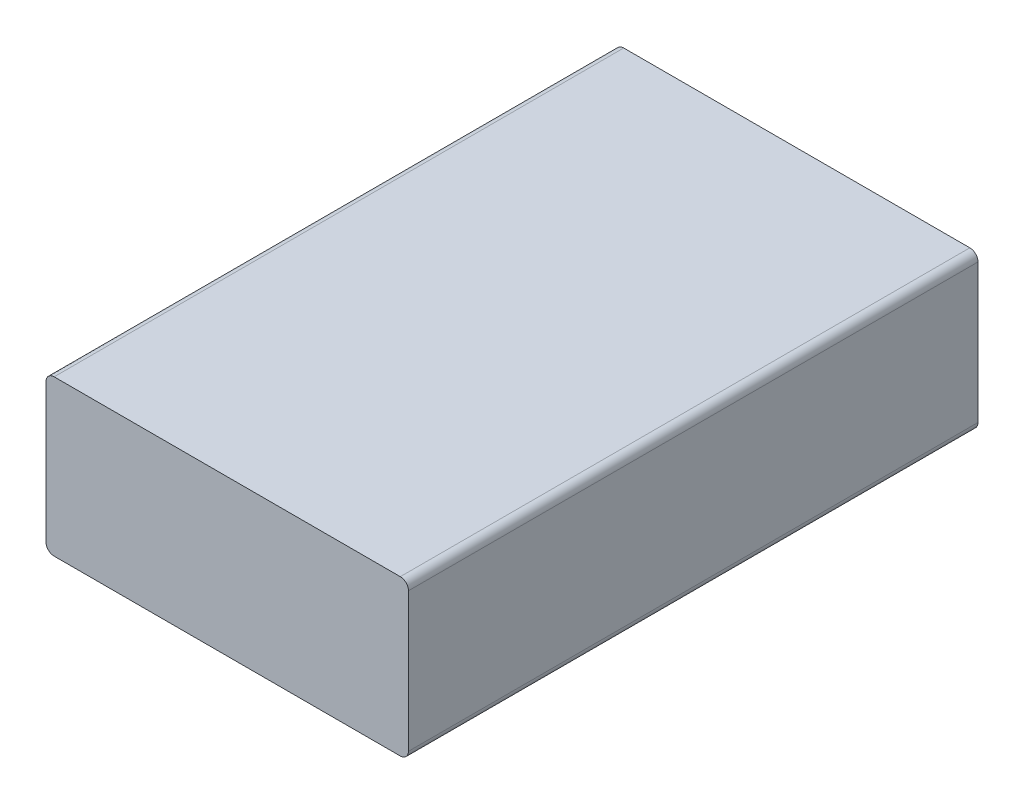
ISO-10303-21;
HEADER;
FILE_DESCRIPTION(('STEP AP214'),'2;1');
FILE_NAME('part.step','',(''),(''),'','','');
FILE_SCHEMA(('AUTOMOTIVE_DESIGN { 1 0 10303 214 1 1 1 1 }'));
ENDSEC;
DATA;
#1=APPLICATION_CONTEXT('core data for automotive mechanical design processes');
#2=APPLICATION_PROTOCOL_DEFINITION('international standard','automotive_design',2000,#1);
#3=PRODUCT_CONTEXT('',#1,'mechanical');
#4=PRODUCT('Part','Part','',(#3));
#5=PRODUCT_RELATED_PRODUCT_CATEGORY('part','',(#4));
#6=PRODUCT_DEFINITION_FORMATION('','',#4);
#7=PRODUCT_DEFINITION_CONTEXT('part definition',#1,'design');
#8=PRODUCT_DEFINITION('design','',#6,#7);
#9=PRODUCT_DEFINITION_SHAPE('','',#8);
#10=(LENGTH_UNIT() NAMED_UNIT(*) SI_UNIT(.MILLI.,.METRE.));
#11=(NAMED_UNIT(*) PLANE_ANGLE_UNIT() SI_UNIT($,.RADIAN.));
#12=(NAMED_UNIT(*) SI_UNIT($,.STERADIAN.) SOLID_ANGLE_UNIT());
#13=UNCERTAINTY_MEASURE_WITH_UNIT(LENGTH_MEASURE(1.E-05),#10,'distance_accuracy_value','');
#14=(GEOMETRIC_REPRESENTATION_CONTEXT(3) GLOBAL_UNCERTAINTY_ASSIGNED_CONTEXT((#13)) GLOBAL_UNIT_ASSIGNED_CONTEXT((#10,
#11,#12)) REPRESENTATION_CONTEXT('',''));
#15=CARTESIAN_POINT('',(0.,0.,0.));
#16=DIRECTION('',(0.,0.,1.));
#17=DIRECTION('',(1.,0.,0.));
#18=AXIS2_PLACEMENT_3D('',#15,#16,#17);
#19=CARTESIAN_POINT('',(44.45,-19.05,139.7));
#20=DIRECTION('',(-1.,0.,0.));
#21=DIRECTION('',(0.,0.,1.));
#22=AXIS2_PLACEMENT_3D('',#19,#20,#21);
#23=PLANE('',#22);
#24=DIRECTION('',(0.,1.,0.));
#25=VECTOR('',#24,1.);
#26=CARTESIAN_POINT('',(44.45,-19.05,0.));
#27=LINE('',#26,#25);
#28=CARTESIAN_POINT('',(44.45,-17.05,0.));
#29=VERTEX_POINT('',#28);
#30=CARTESIAN_POINT('',(44.45,17.05,0.));
#31=VERTEX_POINT('',#30);
#32=EDGE_CURVE('E129',#29,#31,#27,.T.);
#33=ORIENTED_EDGE('',*,*,#32,.T.);
#34=DIRECTION('',(0.,0.,-1.));
#35=VECTOR('',#34,1.);
#36=CARTESIAN_POINT('',(44.45,17.05,139.7));
#37=LINE('',#36,#35);
#38=CARTESIAN_POINT('',(44.45,17.05,139.7));
#39=VERTEX_POINT('',#38);
#40=EDGE_CURVE('E152',#31,#39,#37,.F.);
#41=ORIENTED_EDGE('',*,*,#40,.T.);
#42=DIRECTION('',(0.,1.,0.));
#43=VECTOR('',#42,1.);
#44=CARTESIAN_POINT('',(44.45,-19.05,139.7));
#45=LINE('',#44,#43);
#46=CARTESIAN_POINT('',(44.45,-17.05,139.7));
#47=VERTEX_POINT('',#46);
#48=EDGE_CURVE('E127',#47,#39,#45,.T.);
#49=ORIENTED_EDGE('',*,*,#48,.F.);
#50=DIRECTION('',(0.,0.,-1.));
#51=VECTOR('',#50,1.);
#52=CARTESIAN_POINT('',(44.45,-17.05,139.7));
#53=LINE('',#52,#51);
#54=EDGE_CURVE('E149',#47,#29,#53,.T.);
#55=ORIENTED_EDGE('',*,*,#54,.T.);
#56=EDGE_LOOP('',(#33,#41,#49,#55));
#57=FACE_BOUND('',#56,.T.);
#58=ADVANCED_FACE('F34',(#57),#23,.F.);
#59=CARTESIAN_POINT('',(-44.45,19.05,139.7));
#60=DIRECTION('',(0.,-1.,0.));
#61=DIRECTION('',(0.,0.,-1.));
#62=AXIS2_PLACEMENT_3D('',#59,#60,#61);
#63=PLANE('',#62);
#64=DIRECTION('',(-1.,0.,0.));
#65=VECTOR('',#64,1.);
#66=CARTESIAN_POINT('',(-44.45,19.05,0.));
#67=LINE('',#66,#65);
#68=CARTESIAN_POINT('',(42.45,19.05,0.));
#69=VERTEX_POINT('',#68);
#70=CARTESIAN_POINT('',(-42.45,19.05,0.));
#71=VERTEX_POINT('',#70);
#72=EDGE_CURVE('E125',#69,#71,#67,.T.);
#73=ORIENTED_EDGE('',*,*,#72,.T.);
#74=DIRECTION('',(0.,0.,-1.));
#75=VECTOR('',#74,1.);
#76=CARTESIAN_POINT('',(-42.45,19.05,139.7));
#77=LINE('',#76,#75);
#78=CARTESIAN_POINT('',(-42.45,19.05,139.7));
#79=VERTEX_POINT('',#78);
#80=EDGE_CURVE('E104',#71,#79,#77,.F.);
#81=ORIENTED_EDGE('',*,*,#80,.T.);
#82=DIRECTION('',(-1.,0.,0.));
#83=VECTOR('',#82,1.);
#84=CARTESIAN_POINT('',(-44.45,19.05,139.7));
#85=LINE('',#84,#83);
#86=CARTESIAN_POINT('',(42.45,19.05,139.7));
#87=VERTEX_POINT('',#86);
#88=EDGE_CURVE('E168',#87,#79,#85,.T.);
#89=ORIENTED_EDGE('',*,*,#88,.F.);
#90=DIRECTION('',(0.,0.,-1.));
#91=VECTOR('',#90,1.);
#92=CARTESIAN_POINT('',(42.45,19.05,139.7));
#93=LINE('',#92,#91);
#94=EDGE_CURVE('E109',#87,#69,#93,.T.);
#95=ORIENTED_EDGE('',*,*,#94,.T.);
#96=EDGE_LOOP('',(#73,#81,#89,#95));
#97=FACE_BOUND('',#96,.T.);
#98=ADVANCED_FACE('F185',(#97),#63,.F.);
#99=CARTESIAN_POINT('',(-44.45,-19.05,139.7));
#100=DIRECTION('',(1.,0.,0.));
#101=DIRECTION('',(0.,0.,-1.));
#102=AXIS2_PLACEMENT_3D('',#99,#100,#101);
#103=PLANE('',#102);
#104=DIRECTION('',(0.,-1.,0.));
#105=VECTOR('',#104,1.);
#106=CARTESIAN_POINT('',(-44.45,-19.05,139.7));
#107=LINE('',#106,#105);
#108=CARTESIAN_POINT('',(-44.45,17.05,139.7));
#109=VERTEX_POINT('',#108);
#110=CARTESIAN_POINT('',(-44.45,-17.05,139.7));
#111=VERTEX_POINT('',#110);
#112=EDGE_CURVE('E118',#109,#111,#107,.T.);
#113=ORIENTED_EDGE('',*,*,#112,.F.);
#114=DIRECTION('',(0.,0.,-1.));
#115=VECTOR('',#114,1.);
#116=CARTESIAN_POINT('',(-44.45,17.05,139.7));
#117=LINE('',#116,#115);
#118=CARTESIAN_POINT('',(-44.45,17.05,0.));
#119=VERTEX_POINT('',#118);
#120=EDGE_CURVE('E103',#109,#119,#117,.T.);
#121=ORIENTED_EDGE('',*,*,#120,.T.);
#122=DIRECTION('',(0.,-1.,0.));
#123=VECTOR('',#122,1.);
#124=CARTESIAN_POINT('',(-44.45,-19.05,0.));
#125=LINE('',#124,#123);
#126=CARTESIAN_POINT('',(-44.45,-17.05,0.));
#127=VERTEX_POINT('',#126);
#128=EDGE_CURVE('E116',#119,#127,#125,.T.);
#129=ORIENTED_EDGE('',*,*,#128,.T.);
#130=DIRECTION('',(0.,0.,-1.));
#131=VECTOR('',#130,1.);
#132=CARTESIAN_POINT('',(-44.45,-17.05,139.7));
#133=LINE('',#132,#131);
#134=EDGE_CURVE('E120',#127,#111,#133,.F.);
#135=ORIENTED_EDGE('',*,*,#134,.T.);
#136=EDGE_LOOP('',(#113,#121,#129,#135));
#137=FACE_BOUND('',#136,.T.);
#138=ADVANCED_FACE('F115',(#137),#103,.F.);
#139=CARTESIAN_POINT('',(-44.45,-19.05,139.7));
#140=DIRECTION('',(0.,1.,0.));
#141=DIRECTION('',(0.,0.,1.));
#142=AXIS2_PLACEMENT_3D('',#139,#140,#141);
#143=PLANE('',#142);
#144=DIRECTION('',(1.,0.,0.));
#145=VECTOR('',#144,1.);
#146=CARTESIAN_POINT('',(-44.45,-19.05,0.));
#147=LINE('',#146,#145);
#148=CARTESIAN_POINT('',(-42.45,-19.05,0.));
#149=VERTEX_POINT('',#148);
#150=CARTESIAN_POINT('',(42.45,-19.05,0.));
#151=VERTEX_POINT('',#150);
#152=EDGE_CURVE('E124',#149,#151,#147,.T.);
#153=ORIENTED_EDGE('',*,*,#152,.T.);
#154=DIRECTION('',(0.,0.,-1.));
#155=VECTOR('',#154,1.);
#156=CARTESIAN_POINT('',(42.45,-19.05,139.7));
#157=LINE('',#156,#155);
#158=CARTESIAN_POINT('',(42.45,-19.05,139.7));
#159=VERTEX_POINT('',#158);
#160=EDGE_CURVE('E11',#151,#159,#157,.F.);
#161=ORIENTED_EDGE('',*,*,#160,.T.);
#162=DIRECTION('',(1.,0.,0.));
#163=VECTOR('',#162,1.);
#164=CARTESIAN_POINT('',(-44.45,-19.05,139.7));
#165=LINE('',#164,#163);
#166=CARTESIAN_POINT('',(-42.45,-19.05,139.7));
#167=VERTEX_POINT('',#166);
#168=EDGE_CURVE('E133',#167,#159,#165,.T.);
#169=ORIENTED_EDGE('',*,*,#168,.F.);
#170=DIRECTION('',(0.,0.,-1.));
#171=VECTOR('',#170,1.);
#172=CARTESIAN_POINT('',(-42.45,-19.05,139.7));
#173=LINE('',#172,#171);
#174=EDGE_CURVE('E42',#167,#149,#173,.T.);
#175=ORIENTED_EDGE('',*,*,#174,.T.);
#176=EDGE_LOOP('',(#153,#161,#169,#175));
#177=FACE_BOUND('',#176,.T.);
#178=ADVANCED_FACE('F155',(#177),#143,.F.);
#179=CARTESIAN_POINT('',(0.,0.,139.7));
#180=DIRECTION('',(0.,0.,-1.));
#181=DIRECTION('',(-1.,0.,0.));
#182=AXIS2_PLACEMENT_3D('',#179,#180,#181);
#183=PLANE('',#182);
#184=ORIENTED_EDGE('',*,*,#88,.T.);
#185=CARTESIAN_POINT('',(-42.45,17.05,139.7));
#186=DIRECTION('',(0.,0.,-1.));
#187=DIRECTION('',(-1.,0.,0.));
#188=AXIS2_PLACEMENT_3D('',#185,#186,#187);
#189=CIRCLE('',#188,2.);
#190=EDGE_CURVE('E147',#79,#109,#189,.F.);
#191=ORIENTED_EDGE('',*,*,#190,.T.);
#192=ORIENTED_EDGE('',*,*,#112,.T.);
#193=CARTESIAN_POINT('',(-42.45,-17.05,139.7));
#194=DIRECTION('',(0.,0.,-1.));
#195=DIRECTION('',(-1.,0.,0.));
#196=AXIS2_PLACEMENT_3D('',#193,#194,#195);
#197=CIRCLE('',#196,2.);
#198=EDGE_CURVE('E54',#111,#167,#197,.F.);
#199=ORIENTED_EDGE('',*,*,#198,.T.);
#200=ORIENTED_EDGE('',*,*,#168,.T.);
#201=CARTESIAN_POINT('',(42.45,-17.05,139.7));
#202=DIRECTION('',(0.,0.,-1.));
#203=DIRECTION('',(-1.,0.,0.));
#204=AXIS2_PLACEMENT_3D('',#201,#202,#203);
#205=CIRCLE('',#204,2.);
#206=EDGE_CURVE('E143',#159,#47,#205,.F.);
#207=ORIENTED_EDGE('',*,*,#206,.T.);
#208=ORIENTED_EDGE('',*,*,#48,.T.);
#209=CARTESIAN_POINT('',(42.45,17.05,139.7));
#210=DIRECTION('',(0.,0.,-1.));
#211=DIRECTION('',(-1.,0.,0.));
#212=AXIS2_PLACEMENT_3D('',#209,#210,#211);
#213=CIRCLE('',#212,2.);
#214=EDGE_CURVE('E145',#39,#87,#213,.F.);
#215=ORIENTED_EDGE('',*,*,#214,.T.);
#216=EDGE_LOOP('',(#184,#191,#192,#199,#200,#207,#208,#215));
#217=FACE_BOUND('',#216,.T.);
#218=ADVANCED_FACE('F174',(#217),#183,.F.);
#219=CARTESIAN_POINT('',(0.,0.,0.));
#220=DIRECTION('',(0.,0.,-1.));
#221=DIRECTION('',(-1.,0.,0.));
#222=AXIS2_PLACEMENT_3D('',#219,#220,#221);
#223=PLANE('',#222);
#224=ORIENTED_EDGE('',*,*,#128,.F.);
#225=CARTESIAN_POINT('',(-42.45,17.05,0.));
#226=DIRECTION('',(0.,0.,-1.));
#227=DIRECTION('',(-1.,0.,0.));
#228=AXIS2_PLACEMENT_3D('',#225,#226,#227);
#229=CIRCLE('',#228,2.);
#230=EDGE_CURVE('E99',#119,#71,#229,.T.);
#231=ORIENTED_EDGE('',*,*,#230,.T.);
#232=ORIENTED_EDGE('',*,*,#72,.F.);
#233=CARTESIAN_POINT('',(42.45,17.05,0.));
#234=DIRECTION('',(0.,0.,-1.));
#235=DIRECTION('',(-1.,0.,0.));
#236=AXIS2_PLACEMENT_3D('',#233,#234,#235);
#237=CIRCLE('',#236,2.);
#238=EDGE_CURVE('E110',#69,#31,#237,.T.);
#239=ORIENTED_EDGE('',*,*,#238,.T.);
#240=ORIENTED_EDGE('',*,*,#32,.F.);
#241=CARTESIAN_POINT('',(42.45,-17.05,0.));
#242=DIRECTION('',(0.,0.,-1.));
#243=DIRECTION('',(-1.,0.,0.));
#244=AXIS2_PLACEMENT_3D('',#241,#242,#243);
#245=CIRCLE('',#244,2.);
#246=EDGE_CURVE('E136',#29,#151,#245,.T.);
#247=ORIENTED_EDGE('',*,*,#246,.T.);
#248=ORIENTED_EDGE('',*,*,#152,.F.);
#249=CARTESIAN_POINT('',(-42.45,-17.05,0.));
#250=DIRECTION('',(0.,0.,-1.));
#251=DIRECTION('',(-1.,0.,0.));
#252=AXIS2_PLACEMENT_3D('',#249,#250,#251);
#253=CIRCLE('',#252,2.);
#254=EDGE_CURVE('E119',#149,#127,#253,.T.);
#255=ORIENTED_EDGE('',*,*,#254,.T.);
#256=EDGE_LOOP('',(#224,#231,#232,#239,#240,#247,#248,#255));
#257=FACE_BOUND('',#256,.T.);
#258=ADVANCED_FACE('F122',(#257),#223,.T.);
#259=CARTESIAN_POINT('',(-42.45,17.05,139.7));
#260=DIRECTION('',(0.,0.,-1.));
#261=DIRECTION('',(-1.,0.,0.));
#262=AXIS2_PLACEMENT_3D('',#259,#260,#261);
#263=CYLINDRICAL_SURFACE('',#262,2.);
#264=ORIENTED_EDGE('',*,*,#190,.F.);
#265=ORIENTED_EDGE('',*,*,#80,.F.);
#266=ORIENTED_EDGE('',*,*,#230,.F.);
#267=ORIENTED_EDGE('',*,*,#120,.F.);
#268=EDGE_LOOP('',(#264,#265,#266,#267));
#269=FACE_BOUND('',#268,.T.);
#270=ADVANCED_FACE('F102',(#269),#263,.T.);
#271=CARTESIAN_POINT('',(42.45,17.05,139.7));
#272=DIRECTION('',(0.,0.,-1.));
#273=DIRECTION('',(-1.,0.,0.));
#274=AXIS2_PLACEMENT_3D('',#271,#272,#273);
#275=CYLINDRICAL_SURFACE('',#274,2.);
#276=ORIENTED_EDGE('',*,*,#214,.F.);
#277=ORIENTED_EDGE('',*,*,#40,.F.);
#278=ORIENTED_EDGE('',*,*,#238,.F.);
#279=ORIENTED_EDGE('',*,*,#94,.F.);
#280=EDGE_LOOP('',(#276,#277,#278,#279));
#281=FACE_BOUND('',#280,.T.);
#282=ADVANCED_FACE('F196',(#281),#275,.T.);
#283=CARTESIAN_POINT('',(42.45,-17.05,139.7));
#284=DIRECTION('',(0.,0.,-1.));
#285=DIRECTION('',(-1.,0.,0.));
#286=AXIS2_PLACEMENT_3D('',#283,#284,#285);
#287=CYLINDRICAL_SURFACE('',#286,2.);
#288=ORIENTED_EDGE('',*,*,#206,.F.);
#289=ORIENTED_EDGE('',*,*,#160,.F.);
#290=ORIENTED_EDGE('',*,*,#246,.F.);
#291=ORIENTED_EDGE('',*,*,#54,.F.);
#292=EDGE_LOOP('',(#288,#289,#290,#291));
#293=FACE_BOUND('',#292,.T.);
#294=ADVANCED_FACE('F162',(#293),#287,.T.);
#295=CARTESIAN_POINT('',(-42.45,-17.05,139.7));
#296=DIRECTION('',(0.,0.,-1.));
#297=DIRECTION('',(-1.,0.,0.));
#298=AXIS2_PLACEMENT_3D('',#295,#296,#297);
#299=CYLINDRICAL_SURFACE('',#298,2.);
#300=ORIENTED_EDGE('',*,*,#198,.F.);
#301=ORIENTED_EDGE('',*,*,#134,.F.);
#302=ORIENTED_EDGE('',*,*,#254,.F.);
#303=ORIENTED_EDGE('',*,*,#174,.F.);
#304=EDGE_LOOP('',(#300,#301,#302,#303));
#305=FACE_BOUND('',#304,.T.);
#306=ADVANCED_FACE('F36',(#305),#299,.T.);
#307=CLOSED_SHELL('',(#58,#98,#138,#178,#218,#258,#270,#282,#294,#306));
#308=MANIFOLD_SOLID_BREP('B2',#307);
#309=ADVANCED_BREP_SHAPE_REPRESENTATION('',(#18,#308),#14);
#310=SHAPE_DEFINITION_REPRESENTATION(#9,#309);
ENDSEC;
END-ISO-10303-21;
